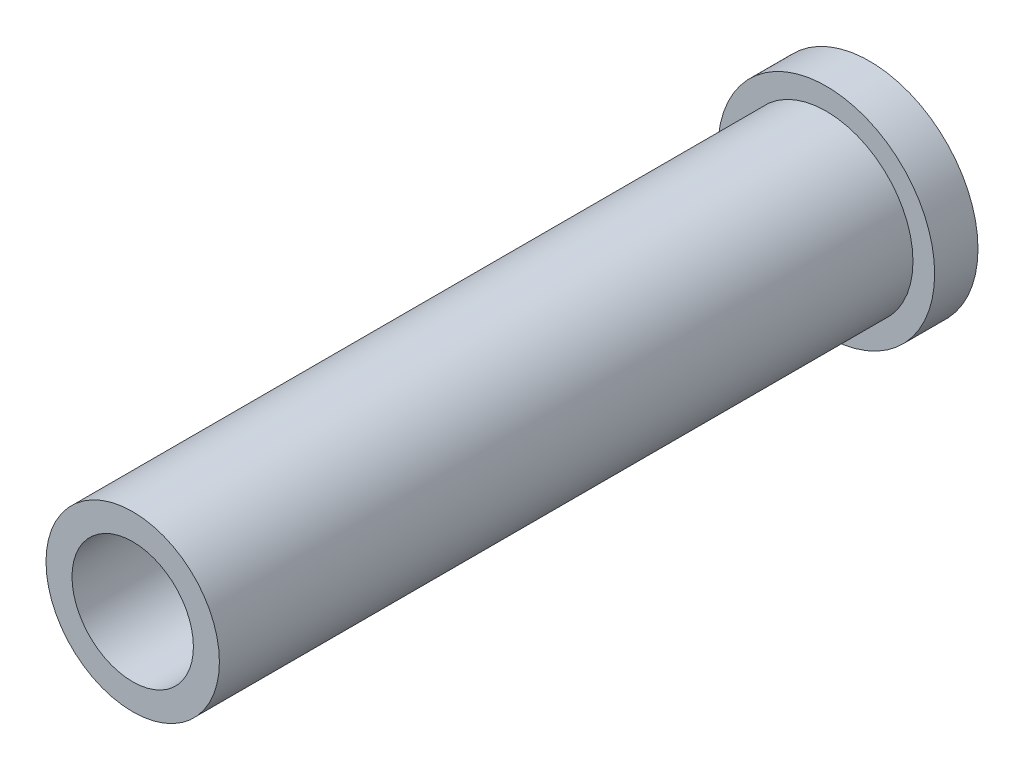
ISO-10303-21;
HEADER;
FILE_DESCRIPTION(('STEP AP214'),'2;1');
FILE_NAME('part.step','',(''),(''),'','','');
FILE_SCHEMA(('AUTOMOTIVE_DESIGN { 1 0 10303 214 1 1 1 1 }'));
ENDSEC;
DATA;
#1=APPLICATION_CONTEXT('core data for automotive mechanical design processes');
#2=APPLICATION_PROTOCOL_DEFINITION('international standard','automotive_design',2000,#1);
#3=PRODUCT_CONTEXT('',#1,'mechanical');
#4=PRODUCT('Part','Part','',(#3));
#5=PRODUCT_RELATED_PRODUCT_CATEGORY('part','',(#4));
#6=PRODUCT_DEFINITION_FORMATION('','',#4);
#7=PRODUCT_DEFINITION_CONTEXT('part definition',#1,'design');
#8=PRODUCT_DEFINITION('design','',#6,#7);
#9=PRODUCT_DEFINITION_SHAPE('','',#8);
#10=(LENGTH_UNIT() NAMED_UNIT(*) SI_UNIT(.MILLI.,.METRE.));
#11=(NAMED_UNIT(*) PLANE_ANGLE_UNIT() SI_UNIT($,.RADIAN.));
#12=(NAMED_UNIT(*) SI_UNIT($,.STERADIAN.) SOLID_ANGLE_UNIT());
#13=UNCERTAINTY_MEASURE_WITH_UNIT(LENGTH_MEASURE(1.E-05),#10,'distance_accuracy_value','');
#14=(GEOMETRIC_REPRESENTATION_CONTEXT(3) GLOBAL_UNCERTAINTY_ASSIGNED_CONTEXT((#13)) GLOBAL_UNIT_ASSIGNED_CONTEXT((#10,
#11,#12)) REPRESENTATION_CONTEXT('',''));
#15=CARTESIAN_POINT('',(0.,0.,0.));
#16=DIRECTION('',(0.,0.,1.));
#17=DIRECTION('',(1.,0.,0.));
#18=AXIS2_PLACEMENT_3D('',#15,#16,#17);
#19=CARTESIAN_POINT('',(0.,0.,16.));
#20=DIRECTION('',(0.,0.,1.));
#21=DIRECTION('',(1.,0.,0.));
#22=AXIS2_PLACEMENT_3D('',#19,#20,#21);
#23=PLANE('',#22);
#24=CARTESIAN_POINT('',(0.,0.,16.));
#25=DIRECTION('',(0.,0.,1.));
#26=DIRECTION('',(1.,0.,0.));
#27=AXIS2_PLACEMENT_3D('',#24,#25,#26);
#28=CIRCLE('',#27,2.);
#29=CARTESIAN_POINT('',(2.,0.,16.));
#30=VERTEX_POINT('',#29);
#31=EDGE_CURVE('E11',#30,#30,#28,.T.);
#32=ORIENTED_EDGE('',*,*,#31,.T.);
#33=EDGE_LOOP('',(#32));
#34=FACE_BOUND('',#33,.T.);
#35=CARTESIAN_POINT('',(0.,0.,16.));
#36=DIRECTION('',(0.,0.,1.));
#37=DIRECTION('',(1.,0.,0.));
#38=AXIS2_PLACEMENT_3D('',#35,#36,#37);
#39=CIRCLE('',#38,1.4);
#40=CARTESIAN_POINT('',(1.4,0.,16.));
#41=VERTEX_POINT('',#40);
#42=EDGE_CURVE('E55',#41,#41,#39,.T.);
#43=ORIENTED_EDGE('',*,*,#42,.F.);
#44=EDGE_LOOP('',(#43));
#45=FACE_BOUND('',#44,.T.);
#46=ADVANCED_FACE('F46',(#34,#45),#23,.T.);
#47=CARTESIAN_POINT('',(0.,0.,16.));
#48=DIRECTION('',(0.,0.,-1.));
#49=DIRECTION('',(-1.,0.,0.));
#50=AXIS2_PLACEMENT_3D('',#47,#48,#49);
#51=CYLINDRICAL_SURFACE('',#50,2.);
#52=ORIENTED_EDGE('',*,*,#31,.F.);
#53=EDGE_LOOP('',(#52));
#54=FACE_BOUND('',#53,.T.);
#55=CARTESIAN_POINT('',(0.,0.,0.));
#56=DIRECTION('',(0.,0.,1.));
#57=DIRECTION('',(1.,0.,0.));
#58=AXIS2_PLACEMENT_3D('',#55,#56,#57);
#59=CIRCLE('',#58,2.);
#60=CARTESIAN_POINT('',(2.,0.,0.));
#61=VERTEX_POINT('',#60);
#62=EDGE_CURVE('E50',#61,#61,#59,.T.);
#63=ORIENTED_EDGE('',*,*,#62,.T.);
#64=EDGE_LOOP('',(#63));
#65=FACE_BOUND('',#64,.T.);
#66=ADVANCED_FACE('F48',(#54,#65),#51,.T.);
#67=CARTESIAN_POINT('',(0.,0.,16.));
#68=DIRECTION('',(0.,0.,-1.));
#69=DIRECTION('',(-1.,0.,0.));
#70=AXIS2_PLACEMENT_3D('',#67,#68,#69);
#71=CYLINDRICAL_SURFACE('',#70,1.4);
#72=ORIENTED_EDGE('',*,*,#42,.T.);
#73=EDGE_LOOP('',(#72));
#74=FACE_BOUND('',#73,.T.);
#75=CARTESIAN_POINT('',(0.,0.,-1.));
#76=DIRECTION('',(0.,0.,-1.));
#77=DIRECTION('',(-1.,0.,0.));
#78=AXIS2_PLACEMENT_3D('',#75,#76,#77);
#79=CIRCLE('',#78,1.4);
#80=CARTESIAN_POINT('',(-1.4,0.,-1.));
#81=VERTEX_POINT('',#80);
#82=EDGE_CURVE('E67',#81,#81,#79,.T.);
#83=ORIENTED_EDGE('',*,*,#82,.T.);
#84=EDGE_LOOP('',(#83));
#85=FACE_BOUND('',#84,.T.);
#86=ADVANCED_FACE('F75',(#74,#85),#71,.F.);
#87=CARTESIAN_POINT('',(0.,0.,-1.));
#88=DIRECTION('',(0.,0.,1.));
#89=DIRECTION('',(1.,0.,0.));
#90=AXIS2_PLACEMENT_3D('',#87,#88,#89);
#91=CYLINDRICAL_SURFACE('',#90,2.5);
#92=CARTESIAN_POINT('',(0.,0.,-1.));
#93=DIRECTION('',(0.,0.,-1.));
#94=DIRECTION('',(-1.,0.,0.));
#95=AXIS2_PLACEMENT_3D('',#92,#93,#94);
#96=CIRCLE('',#95,2.5);
#97=CARTESIAN_POINT('',(-2.5,0.,-1.));
#98=VERTEX_POINT('',#97);
#99=EDGE_CURVE('E66',#98,#98,#96,.T.);
#100=ORIENTED_EDGE('',*,*,#99,.F.);
#101=EDGE_LOOP('',(#100));
#102=FACE_BOUND('',#101,.T.);
#103=CARTESIAN_POINT('',(0.,0.,0.));
#104=DIRECTION('',(0.,0.,-1.));
#105=DIRECTION('',(-1.,0.,0.));
#106=AXIS2_PLACEMENT_3D('',#103,#104,#105);
#107=CIRCLE('',#106,2.5);
#108=CARTESIAN_POINT('',(-2.5,0.,0.));
#109=VERTEX_POINT('',#108);
#110=EDGE_CURVE('E62',#109,#109,#107,.T.);
#111=ORIENTED_EDGE('',*,*,#110,.T.);
#112=EDGE_LOOP('',(#111));
#113=FACE_BOUND('',#112,.T.);
#114=ADVANCED_FACE('F81',(#102,#113),#91,.T.);
#115=CARTESIAN_POINT('',(0.,0.,-1.));
#116=DIRECTION('',(0.,0.,-1.));
#117=DIRECTION('',(-1.,0.,0.));
#118=AXIS2_PLACEMENT_3D('',#115,#116,#117);
#119=PLANE('',#118);
#120=ORIENTED_EDGE('',*,*,#82,.F.);
#121=EDGE_LOOP('',(#120));
#122=FACE_BOUND('',#121,.T.);
#123=ORIENTED_EDGE('',*,*,#99,.T.);
#124=EDGE_LOOP('',(#123));
#125=FACE_BOUND('',#124,.T.);
#126=ADVANCED_FACE('F77',(#122,#125),#119,.T.);
#127=CARTESIAN_POINT('',(0.,0.,0.));
#128=DIRECTION('',(0.,0.,-1.));
#129=DIRECTION('',(-1.,0.,0.));
#130=AXIS2_PLACEMENT_3D('',#127,#128,#129);
#131=PLANE('',#130);
#132=ORIENTED_EDGE('',*,*,#62,.F.);
#133=EDGE_LOOP('',(#132));
#134=FACE_BOUND('',#133,.T.);
#135=ORIENTED_EDGE('',*,*,#110,.F.);
#136=EDGE_LOOP('',(#135));
#137=FACE_BOUND('',#136,.T.);
#138=ADVANCED_FACE('F80',(#134,#137),#131,.F.);
#139=CLOSED_SHELL('',(#46,#66,#86,#114,#126,#138));
#140=MANIFOLD_SOLID_BREP('B2',#139);
#141=ADVANCED_BREP_SHAPE_REPRESENTATION('',(#18,#140),#14);
#142=SHAPE_DEFINITION_REPRESENTATION(#9,#141);
ENDSEC;
END-ISO-10303-21;
